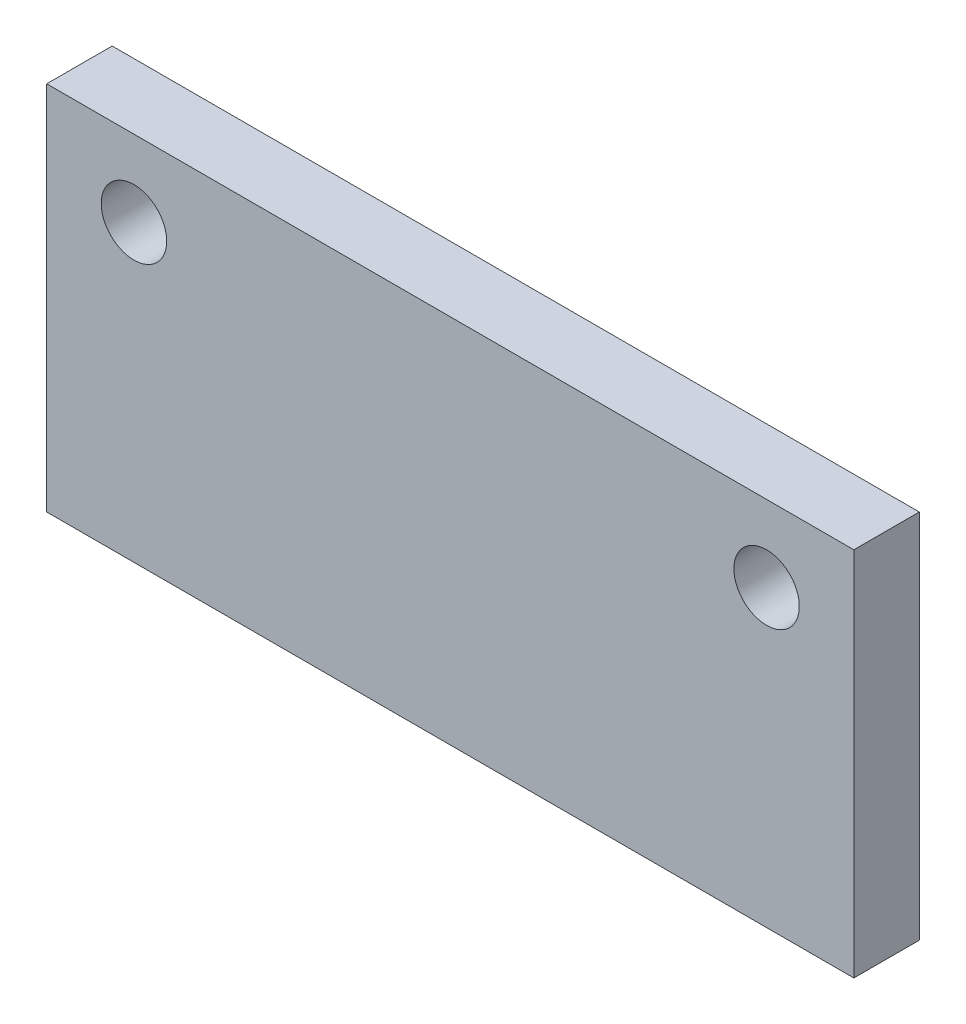
ISO-10303-21;
HEADER;
FILE_DESCRIPTION(('STEP AP214'),'2;1');
FILE_NAME('part.step','',(''),(''),'','','');
FILE_SCHEMA(('AUTOMOTIVE_DESIGN { 1 0 10303 214 1 1 1 1 }'));
ENDSEC;
DATA;
#1=APPLICATION_CONTEXT('core data for automotive mechanical design processes');
#2=APPLICATION_PROTOCOL_DEFINITION('international standard','automotive_design',2000,#1);
#3=PRODUCT_CONTEXT('',#1,'mechanical');
#4=PRODUCT('Part','Part','',(#3));
#5=PRODUCT_RELATED_PRODUCT_CATEGORY('part','',(#4));
#6=PRODUCT_DEFINITION_FORMATION('','',#4);
#7=PRODUCT_DEFINITION_CONTEXT('part definition',#1,'design');
#8=PRODUCT_DEFINITION('design','',#6,#7);
#9=PRODUCT_DEFINITION_SHAPE('','',#8);
#10=(LENGTH_UNIT() NAMED_UNIT(*) SI_UNIT(.MILLI.,.METRE.));
#11=(NAMED_UNIT(*) PLANE_ANGLE_UNIT() SI_UNIT($,.RADIAN.));
#12=(NAMED_UNIT(*) SI_UNIT($,.STERADIAN.) SOLID_ANGLE_UNIT());
#13=UNCERTAINTY_MEASURE_WITH_UNIT(LENGTH_MEASURE(1.E-05),#10,'distance_accuracy_value','');
#14=(GEOMETRIC_REPRESENTATION_CONTEXT(3) GLOBAL_UNCERTAINTY_ASSIGNED_CONTEXT((#13)) GLOBAL_UNIT_ASSIGNED_CONTEXT((#10,
#11,#12)) REPRESENTATION_CONTEXT('',''));
#15=CARTESIAN_POINT('',(0.,0.,0.));
#16=DIRECTION('',(0.,0.,1.));
#17=DIRECTION('',(1.,0.,0.));
#18=AXIS2_PLACEMENT_3D('',#15,#16,#17);
#19=CARTESIAN_POINT('',(0.,0.,0.));
#20=DIRECTION('',(0.,0.,1.));
#21=DIRECTION('',(1.,0.,0.));
#22=AXIS2_PLACEMENT_3D('',#19,#20,#21);
#23=PLANE('',#22);
#24=CARTESIAN_POINT('',(-49.2230769230769,29.1038461538461,0.));
#25=DIRECTION('',(0.,0.,-1.));
#26=DIRECTION('',(-1.,0.,0.));
#27=AXIS2_PLACEMENT_3D('',#24,#25,#26);
#28=CIRCLE('',#27,1.5);
#29=CARTESIAN_POINT('',(-50.7230769230769,29.1038461538461,0.));
#30=VERTEX_POINT('',#29);
#31=EDGE_CURVE('E245',#30,#30,#28,.T.);
#32=ORIENTED_EDGE('',*,*,#31,.F.);
#33=EDGE_LOOP('',(#32));
#34=FACE_BOUND('',#33,.T.);
#35=CARTESIAN_POINT('',(-20.2230769230769,29.1038461538461,0.));
#36=DIRECTION('',(0.,0.,-1.));
#37=DIRECTION('',(-1.,0.,0.));
#38=AXIS2_PLACEMENT_3D('',#35,#36,#37);
#39=CIRCLE('',#38,1.5);
#40=CARTESIAN_POINT('',(-21.7230769230769,29.1038461538461,0.));
#41=VERTEX_POINT('',#40);
#42=EDGE_CURVE('E128',#41,#41,#39,.T.);
#43=ORIENTED_EDGE('',*,*,#42,.F.);
#44=EDGE_LOOP('',(#43));
#45=FACE_BOUND('',#44,.T.);
#46=DIRECTION('',(0.,1.,0.));
#47=VECTOR('',#46,1.);
#48=CARTESIAN_POINT('',(-38.7230769230769,15.6038461538461,0.));
#49=LINE('',#48,#47);
#50=CARTESIAN_POINT('',(-38.7230769230769,15.6038461538461,0.));
#51=VERTEX_POINT('',#50);
#52=CARTESIAN_POINT('',(-38.7230769230769,22.6038461538461,0.));
#53=VERTEX_POINT('',#52);
#54=EDGE_CURVE('E147',#51,#53,#49,.T.);
#55=ORIENTED_EDGE('',*,*,#54,.F.);
#56=DIRECTION('',(1.,0.,0.));
#57=VECTOR('',#56,1.);
#58=CARTESIAN_POINT('',(-53.2230769230769,15.6038461538461,0.));
#59=LINE('',#58,#57);
#60=CARTESIAN_POINT('',(-53.2230769230769,15.6038461538461,0.));
#61=VERTEX_POINT('',#60);
#62=EDGE_CURVE('E174',#61,#51,#59,.T.);
#63=ORIENTED_EDGE('',*,*,#62,.F.);
#64=DIRECTION('',(0.,-1.,0.));
#65=VECTOR('',#64,1.);
#66=CARTESIAN_POINT('',(-53.2230769230769,28.6038461538461,0.));
#67=LINE('',#66,#65);
#68=CARTESIAN_POINT('',(-53.2230769230769,32.6038461538461,0.));
#69=VERTEX_POINT('',#68);
#70=EDGE_CURVE('E181',#69,#61,#67,.T.);
#71=ORIENTED_EDGE('',*,*,#70,.F.);
#72=DIRECTION('',(-1.,0.,0.));
#73=VECTOR('',#72,1.);
#74=CARTESIAN_POINT('',(-53.2230769230769,32.6038461538461,0.));
#75=LINE('',#74,#73);
#76=CARTESIAN_POINT('',(-16.2230769230769,32.6038461538461,0.));
#77=VERTEX_POINT('',#76);
#78=EDGE_CURVE('E124',#77,#69,#75,.T.);
#79=ORIENTED_EDGE('',*,*,#78,.F.);
#80=DIRECTION('',(0.,1.,0.));
#81=VECTOR('',#80,1.);
#82=CARTESIAN_POINT('',(-16.2230769230769,28.6038461538461,0.));
#83=LINE('',#82,#81);
#84=CARTESIAN_POINT('',(-16.2230769230769,15.6038461538461,0.));
#85=VERTEX_POINT('',#84);
#86=EDGE_CURVE('E109',#85,#77,#83,.T.);
#87=ORIENTED_EDGE('',*,*,#86,.F.);
#88=CARTESIAN_POINT('',(-30.7230769230769,15.6038461538461,0.));
#89=VERTEX_POINT('',#88);
#90=EDGE_CURVE('E178',#89,#85,#59,.T.);
#91=ORIENTED_EDGE('',*,*,#90,.F.);
#92=DIRECTION('',(0.,-1.,0.));
#93=VECTOR('',#92,1.);
#94=CARTESIAN_POINT('',(-30.7230769230769,15.6038461538461,0.));
#95=LINE('',#94,#93);
#96=CARTESIAN_POINT('',(-30.7230769230769,22.6038461538461,0.));
#97=VERTEX_POINT('',#96);
#98=EDGE_CURVE('E152',#97,#89,#95,.T.);
#99=ORIENTED_EDGE('',*,*,#98,.F.);
#100=DIRECTION('',(1.,0.,0.));
#101=VECTOR('',#100,1.);
#102=CARTESIAN_POINT('',(-38.7230769230769,22.6038461538461,0.));
#103=LINE('',#102,#101);
#104=EDGE_CURVE('E150',#53,#97,#103,.T.);
#105=ORIENTED_EDGE('',*,*,#104,.F.);
#106=EDGE_LOOP('',(#55,#63,#71,#79,#87,#91,#99,#105));
#107=FACE_BOUND('',#106,.T.);
#108=ADVANCED_FACE('F32',(#34,#45,#107),#23,.F.);
#109=CARTESIAN_POINT('',(-53.2230769230769,28.6038461538461,3.));
#110=DIRECTION('',(1.,0.,0.));
#111=DIRECTION('',(0.,0.,-1.));
#112=AXIS2_PLACEMENT_3D('',#109,#110,#111);
#113=PLANE('',#112);
#114=ORIENTED_EDGE('',*,*,#70,.T.);
#115=DIRECTION('',(0.,0.,-1.));
#116=VECTOR('',#115,1.);
#117=CARTESIAN_POINT('',(-53.2230769230769,15.6038461538461,3.));
#118=LINE('',#117,#116);
#119=CARTESIAN_POINT('',(-53.2230769230769,15.6038461538461,3.));
#120=VERTEX_POINT('',#119);
#121=EDGE_CURVE('E11',#120,#61,#118,.T.);
#122=ORIENTED_EDGE('',*,*,#121,.F.);
#123=DIRECTION('',(0.,-1.,0.));
#124=VECTOR('',#123,1.);
#125=CARTESIAN_POINT('',(-53.2230769230769,28.6038461538461,3.));
#126=LINE('',#125,#124);
#127=CARTESIAN_POINT('',(-53.2230769230769,32.6038461538461,3.));
#128=VERTEX_POINT('',#127);
#129=EDGE_CURVE('E102',#128,#120,#126,.T.);
#130=ORIENTED_EDGE('',*,*,#129,.F.);
#131=DIRECTION('',(0.,0.,1.));
#132=VECTOR('',#131,1.);
#133=CARTESIAN_POINT('',(-53.2230769230769,32.6038461538461,0.));
#134=LINE('',#133,#132);
#135=EDGE_CURVE('E106',#69,#128,#134,.T.);
#136=ORIENTED_EDGE('',*,*,#135,.F.);
#137=EDGE_LOOP('',(#114,#122,#130,#136));
#138=FACE_BOUND('',#137,.T.);
#139=ADVANCED_FACE('F34',(#138),#113,.F.);
#140=CARTESIAN_POINT('',(-53.2230769230769,15.6038461538461,3.));
#141=DIRECTION('',(0.,1.,0.));
#142=DIRECTION('',(0.,0.,1.));
#143=AXIS2_PLACEMENT_3D('',#140,#141,#142);
#144=PLANE('',#143);
#145=DIRECTION('',(0.,0.,1.));
#146=VECTOR('',#145,1.);
#147=CARTESIAN_POINT('',(-38.7230769230769,15.6038461538461,-7.));
#148=LINE('',#147,#146);
#149=CARTESIAN_POINT('',(-38.7230769230769,15.6038461538461,-4.20047765555864));
#150=VERTEX_POINT('',#149);
#151=EDGE_CURVE('E36',#150,#51,#148,.T.);
#152=ORIENTED_EDGE('',*,*,#151,.F.);
#153=DIRECTION('',(1.,0.,0.));
#154=VECTOR('',#153,1.);
#155=CARTESIAN_POINT('',(-38.7230769230769,15.6038461538461,-4.20047765555864));
#156=LINE('',#155,#154);
#157=CARTESIAN_POINT('',(-30.7230769230769,15.6038461538461,-4.20047765555864));
#158=VERTEX_POINT('',#157);
#159=EDGE_CURVE('E144',#150,#158,#156,.T.);
#160=ORIENTED_EDGE('',*,*,#159,.T.);
#161=DIRECTION('',(0.,0.,1.));
#162=VECTOR('',#161,1.);
#163=CARTESIAN_POINT('',(-30.7230769230769,15.6038461538461,-7.));
#164=LINE('',#163,#162);
#165=EDGE_CURVE('E163',#158,#89,#164,.T.);
#166=ORIENTED_EDGE('',*,*,#165,.T.);
#167=ORIENTED_EDGE('',*,*,#90,.T.);
#168=DIRECTION('',(0.,0.,-1.));
#169=VECTOR('',#168,1.);
#170=CARTESIAN_POINT('',(-16.2230769230769,15.6038461538461,3.));
#171=LINE('',#170,#169);
#172=CARTESIAN_POINT('',(-16.2230769230769,15.6038461538461,3.));
#173=VERTEX_POINT('',#172);
#174=EDGE_CURVE('E42',#173,#85,#171,.T.);
#175=ORIENTED_EDGE('',*,*,#174,.F.);
#176=DIRECTION('',(1.,0.,0.));
#177=VECTOR('',#176,1.);
#178=CARTESIAN_POINT('',(-53.2230769230769,15.6038461538461,3.));
#179=LINE('',#178,#177);
#180=EDGE_CURVE('E108',#120,#173,#179,.T.);
#181=ORIENTED_EDGE('',*,*,#180,.F.);
#182=ORIENTED_EDGE('',*,*,#121,.T.);
#183=ORIENTED_EDGE('',*,*,#62,.T.);
#184=EDGE_LOOP('',(#152,#160,#166,#167,#175,#181,#182,#183));
#185=FACE_BOUND('',#184,.T.);
#186=ADVANCED_FACE('F177',(#185),#144,.F.);
#187=CARTESIAN_POINT('',(-16.2230769230769,28.6038461538461,3.));
#188=DIRECTION('',(-1.,0.,0.));
#189=DIRECTION('',(0.,0.,1.));
#190=AXIS2_PLACEMENT_3D('',#187,#188,#189);
#191=PLANE('',#190);
#192=ORIENTED_EDGE('',*,*,#86,.T.);
#193=DIRECTION('',(0.,0.,-1.));
#194=VECTOR('',#193,1.);
#195=CARTESIAN_POINT('',(-16.2230769230769,32.6038461538461,0.));
#196=LINE('',#195,#194);
#197=CARTESIAN_POINT('',(-16.2230769230769,32.6038461538461,3.));
#198=VERTEX_POINT('',#197);
#199=EDGE_CURVE('E119',#198,#77,#196,.T.);
#200=ORIENTED_EDGE('',*,*,#199,.F.);
#201=DIRECTION('',(0.,1.,0.));
#202=VECTOR('',#201,1.);
#203=CARTESIAN_POINT('',(-16.2230769230769,28.6038461538461,3.));
#204=LINE('',#203,#202);
#205=EDGE_CURVE('E115',#173,#198,#204,.T.);
#206=ORIENTED_EDGE('',*,*,#205,.F.);
#207=ORIENTED_EDGE('',*,*,#174,.T.);
#208=EDGE_LOOP('',(#192,#200,#206,#207));
#209=FACE_BOUND('',#208,.T.);
#210=ADVANCED_FACE('F194',(#209),#191,.F.);
#211=CARTESIAN_POINT('',(0.,0.,3.));
#212=DIRECTION('',(0.,0.,1.));
#213=DIRECTION('',(1.,0.,0.));
#214=AXIS2_PLACEMENT_3D('',#211,#212,#213);
#215=PLANE('',#214);
#216=CARTESIAN_POINT('',(-49.2230769230769,29.1038461538461,3.));
#217=DIRECTION('',(0.,0.,-1.));
#218=DIRECTION('',(-1.,0.,0.));
#219=AXIS2_PLACEMENT_3D('',#216,#217,#218);
#220=CIRCLE('',#219,1.5);
#221=CARTESIAN_POINT('',(-50.7230769230769,29.1038461538461,3.));
#222=VERTEX_POINT('',#221);
#223=EDGE_CURVE('E243',#222,#222,#220,.T.);
#224=ORIENTED_EDGE('',*,*,#223,.T.);
#225=EDGE_LOOP('',(#224));
#226=FACE_BOUND('',#225,.T.);
#227=CARTESIAN_POINT('',(-20.2230769230769,29.1038461538461,3.));
#228=DIRECTION('',(0.,0.,-1.));
#229=DIRECTION('',(-1.,0.,0.));
#230=AXIS2_PLACEMENT_3D('',#227,#228,#229);
#231=CIRCLE('',#230,1.5);
#232=CARTESIAN_POINT('',(-21.7230769230769,29.1038461538461,3.));
#233=VERTEX_POINT('',#232);
#234=EDGE_CURVE('E125',#233,#233,#231,.T.);
#235=ORIENTED_EDGE('',*,*,#234,.T.);
#236=EDGE_LOOP('',(#235));
#237=FACE_BOUND('',#236,.T.);
#238=ORIENTED_EDGE('',*,*,#129,.T.);
#239=ORIENTED_EDGE('',*,*,#180,.T.);
#240=ORIENTED_EDGE('',*,*,#205,.T.);
#241=DIRECTION('',(1.,0.,0.));
#242=VECTOR('',#241,1.);
#243=CARTESIAN_POINT('',(-53.2230769230769,32.6038461538461,3.));
#244=LINE('',#243,#242);
#245=EDGE_CURVE('E112',#128,#198,#244,.T.);
#246=ORIENTED_EDGE('',*,*,#245,.F.);
#247=EDGE_LOOP('',(#238,#239,#240,#246));
#248=FACE_BOUND('',#247,.T.);
#249=ADVANCED_FACE('F113',(#226,#237,#248),#215,.T.);
#250=CARTESIAN_POINT('',(-38.7230769230769,15.6038461538461,-7.));
#251=DIRECTION('',(1.,0.,0.));
#252=DIRECTION('',(0.,0.,-1.));
#253=AXIS2_PLACEMENT_3D('',#250,#251,#252);
#254=PLANE('',#253);
#255=CARTESIAN_POINT('',(-38.7230769230769,19.1038461538461,-4.20047765555864));
#256=DIRECTION('',(1.,0.,0.));
#257=DIRECTION('',(0.,0.,-1.));
#258=AXIS2_PLACEMENT_3D('',#255,#256,#257);
#259=CIRCLE('',#258,1.55);
#260=CARTESIAN_POINT('',(-38.7230769230769,19.1038461538461,-5.75047765555864));
#261=VERTEX_POINT('',#260);
#262=EDGE_CURVE('E135',#261,#261,#259,.T.);
#263=ORIENTED_EDGE('',*,*,#262,.T.);
#264=EDGE_LOOP('',(#263));
#265=FACE_BOUND('',#264,.T.);
#266=DIRECTION('',(0.,0.,1.));
#267=VECTOR('',#266,1.);
#268=CARTESIAN_POINT('',(-38.7230769230769,22.6038461538461,-7.));
#269=LINE('',#268,#267);
#270=CARTESIAN_POINT('',(-38.7230769230769,22.6038461538461,-4.20047765555864));
#271=VERTEX_POINT('',#270);
#272=EDGE_CURVE('E57',#271,#53,#269,.T.);
#273=ORIENTED_EDGE('',*,*,#272,.F.);
#274=CARTESIAN_POINT('',(-38.7230769230769,19.1038461538461,-3.39661639153411));
#275=DIRECTION('',(-1.,0.,0.));
#276=DIRECTION('',(0.,0.,1.));
#277=AXIS2_PLACEMENT_3D('',#274,#275,#276);
#278=CIRCLE('',#277,3.59112697238612);
#279=EDGE_CURVE('E141',#271,#150,#278,.T.);
#280=ORIENTED_EDGE('',*,*,#279,.T.);
#281=ORIENTED_EDGE('',*,*,#151,.T.);
#282=ORIENTED_EDGE('',*,*,#54,.T.);
#283=EDGE_LOOP('',(#273,#280,#281,#282));
#284=FACE_BOUND('',#283,.T.);
#285=ADVANCED_FACE('F171',(#265,#284),#254,.F.);
#286=CARTESIAN_POINT('',(-38.7230769230769,22.6038461538461,-7.));
#287=DIRECTION('',(0.,-1.,0.));
#288=DIRECTION('',(0.,0.,-1.));
#289=AXIS2_PLACEMENT_3D('',#286,#287,#288);
#290=PLANE('',#289);
#291=DIRECTION('',(0.,0.,1.));
#292=VECTOR('',#291,1.);
#293=CARTESIAN_POINT('',(-30.7230769230769,22.6038461538461,-7.));
#294=LINE('',#293,#292);
#295=CARTESIAN_POINT('',(-30.7230769230769,22.6038461538461,-4.20047765555864));
#296=VERTEX_POINT('',#295);
#297=EDGE_CURVE('E155',#296,#97,#294,.T.);
#298=ORIENTED_EDGE('',*,*,#297,.F.);
#299=DIRECTION('',(1.,0.,0.));
#300=VECTOR('',#299,1.);
#301=CARTESIAN_POINT('',(-38.7230769230769,22.6038461538461,-4.20047765555864));
#302=LINE('',#301,#300);
#303=EDGE_CURVE('E50',#271,#296,#302,.T.);
#304=ORIENTED_EDGE('',*,*,#303,.F.);
#305=ORIENTED_EDGE('',*,*,#272,.T.);
#306=ORIENTED_EDGE('',*,*,#104,.T.);
#307=EDGE_LOOP('',(#298,#304,#305,#306));
#308=FACE_BOUND('',#307,.T.);
#309=ADVANCED_FACE('F214',(#308),#290,.F.);
#310=CARTESIAN_POINT('',(-30.7230769230769,15.6038461538461,-7.));
#311=DIRECTION('',(-1.,0.,0.));
#312=DIRECTION('',(0.,0.,1.));
#313=AXIS2_PLACEMENT_3D('',#310,#311,#312);
#314=PLANE('',#313);
#315=CARTESIAN_POINT('',(-30.7230769230769,19.1038461538461,-4.20047765555864));
#316=DIRECTION('',(1.,0.,0.));
#317=DIRECTION('',(0.,0.,-1.));
#318=AXIS2_PLACEMENT_3D('',#315,#316,#317);
#319=CIRCLE('',#318,1.55);
#320=CARTESIAN_POINT('',(-30.7230769230769,19.1038461538461,-5.75047765555864));
#321=VERTEX_POINT('',#320);
#322=EDGE_CURVE('E134',#321,#321,#319,.T.);
#323=ORIENTED_EDGE('',*,*,#322,.F.);
#324=EDGE_LOOP('',(#323));
#325=FACE_BOUND('',#324,.T.);
#326=ORIENTED_EDGE('',*,*,#165,.F.);
#327=CARTESIAN_POINT('',(-30.7230769230769,19.1038461538461,-3.39661639153411));
#328=DIRECTION('',(-1.,0.,0.));
#329=DIRECTION('',(0.,0.,1.));
#330=AXIS2_PLACEMENT_3D('',#327,#328,#329);
#331=CIRCLE('',#330,3.59112697238612);
#332=EDGE_CURVE('E138',#296,#158,#331,.T.);
#333=ORIENTED_EDGE('',*,*,#332,.F.);
#334=ORIENTED_EDGE('',*,*,#297,.T.);
#335=ORIENTED_EDGE('',*,*,#98,.T.);
#336=EDGE_LOOP('',(#326,#333,#334,#335));
#337=FACE_BOUND('',#336,.T.);
#338=ADVANCED_FACE('F218',(#325,#337),#314,.F.);
#339=CARTESIAN_POINT('',(-38.7230769230769,19.1038461538461,-3.39661639153411));
#340=DIRECTION('',(1.,0.,0.));
#341=DIRECTION('',(0.,0.,-1.));
#342=AXIS2_PLACEMENT_3D('',#339,#340,#341);
#343=CYLINDRICAL_SURFACE('',#342,3.59112697238612);
#344=ORIENTED_EDGE('',*,*,#332,.T.);
#345=ORIENTED_EDGE('',*,*,#159,.F.);
#346=ORIENTED_EDGE('',*,*,#279,.F.);
#347=ORIENTED_EDGE('',*,*,#303,.T.);
#348=EDGE_LOOP('',(#344,#345,#346,#347));
#349=FACE_BOUND('',#348,.T.);
#350=ADVANCED_FACE('F221',(#349),#343,.T.);
#351=CARTESIAN_POINT('',(-38.7230769230769,19.1038461538461,-4.20047765555864));
#352=DIRECTION('',(1.,0.,0.));
#353=DIRECTION('',(0.,0.,-1.));
#354=AXIS2_PLACEMENT_3D('',#351,#352,#353);
#355=CYLINDRICAL_SURFACE('',#354,1.55);
#356=ORIENTED_EDGE('',*,*,#262,.F.);
#357=EDGE_LOOP('',(#356));
#358=FACE_BOUND('',#357,.T.);
#359=ORIENTED_EDGE('',*,*,#322,.T.);
#360=EDGE_LOOP('',(#359));
#361=FACE_BOUND('',#360,.T.);
#362=ADVANCED_FACE('F225',(#358,#361),#355,.F.);
#363=CARTESIAN_POINT('',(0.,32.6038461538461,0.));
#364=DIRECTION('',(0.,1.,0.));
#365=DIRECTION('',(0.,0.,1.));
#366=AXIS2_PLACEMENT_3D('',#363,#364,#365);
#367=PLANE('',#366);
#368=ORIENTED_EDGE('',*,*,#135,.T.);
#369=ORIENTED_EDGE('',*,*,#245,.T.);
#370=ORIENTED_EDGE('',*,*,#199,.T.);
#371=ORIENTED_EDGE('',*,*,#78,.T.);
#372=EDGE_LOOP('',(#368,#369,#370,#371));
#373=FACE_BOUND('',#372,.T.);
#374=ADVANCED_FACE('F122',(#373),#367,.T.);
#375=CARTESIAN_POINT('',(-20.2230769230769,29.1038461538461,3.));
#376=DIRECTION('',(0.,0.,-1.));
#377=DIRECTION('',(-1.,0.,0.));
#378=AXIS2_PLACEMENT_3D('',#375,#376,#377);
#379=CYLINDRICAL_SURFACE('',#378,1.5);
#380=ORIENTED_EDGE('',*,*,#234,.F.);
#381=EDGE_LOOP('',(#380));
#382=FACE_BOUND('',#381,.T.);
#383=ORIENTED_EDGE('',*,*,#42,.T.);
#384=EDGE_LOOP('',(#383));
#385=FACE_BOUND('',#384,.T.);
#386=ADVANCED_FACE('F231',(#382,#385),#379,.F.);
#387=CARTESIAN_POINT('',(-49.2230769230769,29.1038461538461,3.));
#388=DIRECTION('',(0.,0.,-1.));
#389=DIRECTION('',(-1.,0.,0.));
#390=AXIS2_PLACEMENT_3D('',#387,#388,#389);
#391=CYLINDRICAL_SURFACE('',#390,1.5);
#392=ORIENTED_EDGE('',*,*,#223,.F.);
#393=EDGE_LOOP('',(#392));
#394=FACE_BOUND('',#393,.T.);
#395=ORIENTED_EDGE('',*,*,#31,.T.);
#396=EDGE_LOOP('',(#395));
#397=FACE_BOUND('',#396,.T.);
#398=ADVANCED_FACE('F234',(#394,#397),#391,.F.);
#399=CLOSED_SHELL('',(#108,#139,#186,#210,#249,#285,#309,#338,#350,#362,#374,#386,#398));
#400=MANIFOLD_SOLID_BREP('B2',#399);
#401=ADVANCED_BREP_SHAPE_REPRESENTATION('',(#18,#400),#14);
#402=SHAPE_DEFINITION_REPRESENTATION(#9,#401);
ENDSEC;
END-ISO-10303-21;
